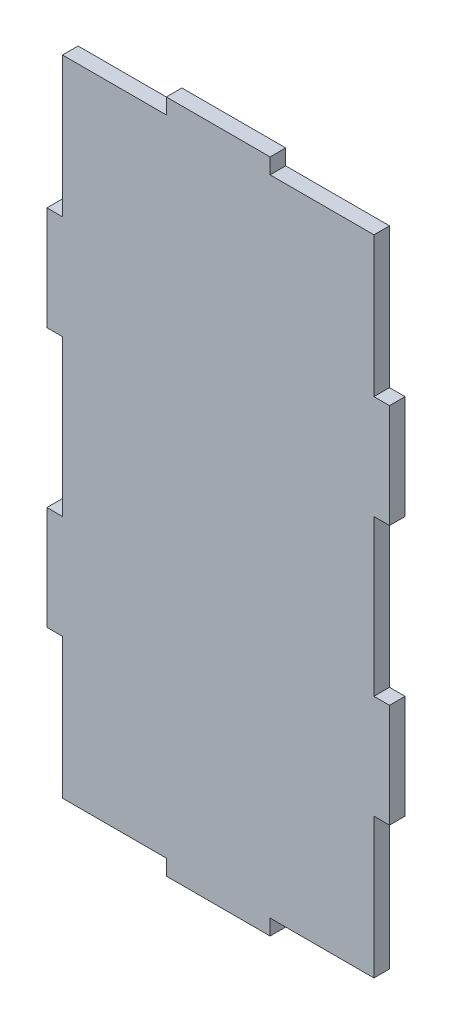
ISO-10303-21;
HEADER;
FILE_DESCRIPTION(('STEP AP214'),'2;1');
FILE_NAME('part.step','',(''),(''),'','','');
FILE_SCHEMA(('AUTOMOTIVE_DESIGN { 1 0 10303 214 1 1 1 1 }'));
ENDSEC;
DATA;
#1=APPLICATION_CONTEXT('core data for automotive mechanical design processes');
#2=APPLICATION_PROTOCOL_DEFINITION('international standard','automotive_design',2000,#1);
#3=PRODUCT_CONTEXT('',#1,'mechanical');
#4=PRODUCT('Part','Part','',(#3));
#5=PRODUCT_RELATED_PRODUCT_CATEGORY('part','',(#4));
#6=PRODUCT_DEFINITION_FORMATION('','',#4);
#7=PRODUCT_DEFINITION_CONTEXT('part definition',#1,'design');
#8=PRODUCT_DEFINITION('design','',#6,#7);
#9=PRODUCT_DEFINITION_SHAPE('','',#8);
#10=(LENGTH_UNIT() NAMED_UNIT(*) SI_UNIT(.MILLI.,.METRE.));
#11=(NAMED_UNIT(*) PLANE_ANGLE_UNIT() SI_UNIT($,.RADIAN.));
#12=(NAMED_UNIT(*) SI_UNIT($,.STERADIAN.) SOLID_ANGLE_UNIT());
#13=UNCERTAINTY_MEASURE_WITH_UNIT(LENGTH_MEASURE(1.E-05),#10,'distance_accuracy_value','');
#14=(GEOMETRIC_REPRESENTATION_CONTEXT(3) GLOBAL_UNCERTAINTY_ASSIGNED_CONTEXT((#13)) GLOBAL_UNIT_ASSIGNED_CONTEXT((#10,
#11,#12)) REPRESENTATION_CONTEXT('',''));
#15=CARTESIAN_POINT('',(0.,0.,0.));
#16=DIRECTION('',(0.,0.,1.));
#17=DIRECTION('',(1.,0.,0.));
#18=AXIS2_PLACEMENT_3D('',#15,#16,#17);
#19=CARTESIAN_POINT('',(0.,61.9999999999997,3.));
#20=DIRECTION('',(0.,-1.,0.));
#21=DIRECTION('',(1.,0.,0.));
#22=AXIS2_PLACEMENT_3D('',#19,#20,#21);
#23=PLANE('',#22);
#24=DIRECTION('',(-1.,0.,0.));
#25=VECTOR('',#24,1.);
#26=CARTESIAN_POINT('',(0.,61.9999999999997,0.));
#27=LINE('',#26,#25);
#28=CARTESIAN_POINT('',(30.,61.9999999999997,0.));
#29=VERTEX_POINT('',#28);
#30=CARTESIAN_POINT('',(9.99999999999999,61.9999999999997,0.));
#31=VERTEX_POINT('',#30);
#32=EDGE_CURVE('E253',#29,#31,#27,.T.);
#33=ORIENTED_EDGE('',*,*,#32,.T.);
#34=DIRECTION('',(0.,0.,-1.));
#35=VECTOR('',#34,1.);
#36=CARTESIAN_POINT('',(9.99999999999999,61.9999999999997,3.));
#37=LINE('',#36,#35);
#38=CARTESIAN_POINT('',(9.99999999999999,61.9999999999997,3.));
#39=VERTEX_POINT('',#38);
#40=EDGE_CURVE('E11',#39,#31,#37,.T.);
#41=ORIENTED_EDGE('',*,*,#40,.F.);
#42=DIRECTION('',(-1.,0.,0.));
#43=VECTOR('',#42,1.);
#44=CARTESIAN_POINT('',(0.,61.9999999999997,3.));
#45=LINE('',#44,#43);
#46=CARTESIAN_POINT('',(30.,61.9999999999997,3.));
#47=VERTEX_POINT('',#46);
#48=EDGE_CURVE('E388',#47,#39,#45,.T.);
#49=ORIENTED_EDGE('',*,*,#48,.F.);
#50=DIRECTION('',(0.,0.,-1.));
#51=VECTOR('',#50,1.);
#52=CARTESIAN_POINT('',(30.,61.9999999999997,3.));
#53=LINE('',#52,#51);
#54=EDGE_CURVE('E247',#47,#29,#53,.T.);
#55=ORIENTED_EDGE('',*,*,#54,.T.);
#56=EDGE_LOOP('',(#33,#41,#49,#55));
#57=FACE_BOUND('',#56,.T.);
#58=ADVANCED_FACE('F35',(#57),#23,.F.);
#59=CARTESIAN_POINT('',(9.99999999999997,0.,3.));
#60=DIRECTION('',(-1.,0.,0.));
#61=DIRECTION('',(0.,-1.,0.));
#62=AXIS2_PLACEMENT_3D('',#59,#60,#61);
#63=PLANE('',#62);
#64=DIRECTION('',(0.,1.,0.));
#65=VECTOR('',#64,1.);
#66=CARTESIAN_POINT('',(9.99999999999997,0.,0.));
#67=LINE('',#66,#65);
#68=CARTESIAN_POINT('',(9.99999999999999,64.9999999999998,0.));
#69=VERTEX_POINT('',#68);
#70=EDGE_CURVE('E256',#31,#69,#67,.T.);
#71=ORIENTED_EDGE('',*,*,#70,.T.);
#72=DIRECTION('',(0.,0.,-1.));
#73=VECTOR('',#72,1.);
#74=CARTESIAN_POINT('',(9.99999999999999,64.9999999999998,3.));
#75=LINE('',#74,#73);
#76=CARTESIAN_POINT('',(9.99999999999999,64.9999999999998,3.));
#77=VERTEX_POINT('',#76);
#78=EDGE_CURVE('E44',#77,#69,#75,.T.);
#79=ORIENTED_EDGE('',*,*,#78,.F.);
#80=DIRECTION('',(0.,1.,0.));
#81=VECTOR('',#80,1.);
#82=CARTESIAN_POINT('',(9.99999999999997,0.,3.));
#83=LINE('',#82,#81);
#84=EDGE_CURVE('E155',#39,#77,#83,.T.);
#85=ORIENTED_EDGE('',*,*,#84,.F.);
#86=ORIENTED_EDGE('',*,*,#40,.T.);
#87=EDGE_LOOP('',(#71,#79,#85,#86));
#88=FACE_BOUND('',#87,.T.);
#89=ADVANCED_FACE('F37',(#88),#63,.F.);
#90=CARTESIAN_POINT('',(0.,64.9999999999998,3.));
#91=DIRECTION('',(0.,-1.,0.));
#92=DIRECTION('',(1.,0.,0.));
#93=AXIS2_PLACEMENT_3D('',#90,#91,#92);
#94=PLANE('',#93);
#95=DIRECTION('',(-1.,0.,0.));
#96=VECTOR('',#95,1.);
#97=CARTESIAN_POINT('',(0.,64.9999999999998,0.));
#98=LINE('',#97,#96);
#99=CARTESIAN_POINT('',(-10.,64.9999999999998,0.));
#100=VERTEX_POINT('',#99);
#101=EDGE_CURVE('E259',#69,#100,#98,.T.);
#102=ORIENTED_EDGE('',*,*,#101,.T.);
#103=DIRECTION('',(0.,0.,-1.));
#104=VECTOR('',#103,1.);
#105=CARTESIAN_POINT('',(-10.,64.9999999999998,3.));
#106=LINE('',#105,#104);
#107=CARTESIAN_POINT('',(-10.,64.9999999999998,3.));
#108=VERTEX_POINT('',#107);
#109=EDGE_CURVE('E364',#108,#100,#106,.T.);
#110=ORIENTED_EDGE('',*,*,#109,.F.);
#111=DIRECTION('',(-1.,0.,0.));
#112=VECTOR('',#111,1.);
#113=CARTESIAN_POINT('',(0.,64.9999999999998,3.));
#114=LINE('',#113,#112);
#115=EDGE_CURVE('E371',#77,#108,#114,.T.);
#116=ORIENTED_EDGE('',*,*,#115,.F.);
#117=ORIENTED_EDGE('',*,*,#78,.T.);
#118=EDGE_LOOP('',(#102,#110,#116,#117));
#119=FACE_BOUND('',#118,.T.);
#120=ADVANCED_FACE('F369',(#119),#94,.F.);
#121=CARTESIAN_POINT('',(-10.,0.,3.));
#122=DIRECTION('',(-1.,0.,0.));
#123=DIRECTION('',(0.,-1.,0.));
#124=AXIS2_PLACEMENT_3D('',#121,#122,#123);
#125=PLANE('',#124);
#126=DIRECTION('',(0.,1.,0.));
#127=VECTOR('',#126,1.);
#128=CARTESIAN_POINT('',(-10.,0.,0.));
#129=LINE('',#128,#127);
#130=CARTESIAN_POINT('',(-10.,61.9999999999997,0.));
#131=VERTEX_POINT('',#130);
#132=EDGE_CURVE('E262',#131,#100,#129,.T.);
#133=ORIENTED_EDGE('',*,*,#132,.F.);
#134=DIRECTION('',(0.,0.,-1.));
#135=VECTOR('',#134,1.);
#136=CARTESIAN_POINT('',(-10.,61.9999999999997,3.));
#137=LINE('',#136,#135);
#138=CARTESIAN_POINT('',(-10.,61.9999999999997,3.));
#139=VERTEX_POINT('',#138);
#140=EDGE_CURVE('E362',#139,#131,#137,.T.);
#141=ORIENTED_EDGE('',*,*,#140,.F.);
#142=DIRECTION('',(0.,1.,0.));
#143=VECTOR('',#142,1.);
#144=CARTESIAN_POINT('',(-10.,0.,3.));
#145=LINE('',#144,#143);
#146=EDGE_CURVE('E383',#139,#108,#145,.T.);
#147=ORIENTED_EDGE('',*,*,#146,.T.);
#148=ORIENTED_EDGE('',*,*,#109,.T.);
#149=EDGE_LOOP('',(#133,#141,#147,#148));
#150=FACE_BOUND('',#149,.T.);
#151=ADVANCED_FACE('F379',(#150),#125,.T.);
#152=CARTESIAN_POINT('',(-30.,61.9999999999997,0.));
#153=VERTEX_POINT('',#152);
#154=EDGE_CURVE('E257',#131,#153,#27,.T.);
#155=ORIENTED_EDGE('',*,*,#154,.T.);
#156=DIRECTION('',(0.,0.,-1.));
#157=VECTOR('',#156,1.);
#158=CARTESIAN_POINT('',(-30.,61.9999999999997,3.));
#159=LINE('',#158,#157);
#160=CARTESIAN_POINT('',(-30.,61.9999999999997,3.));
#161=VERTEX_POINT('',#160);
#162=EDGE_CURVE('E360',#161,#153,#159,.T.);
#163=ORIENTED_EDGE('',*,*,#162,.F.);
#164=EDGE_CURVE('E384',#139,#161,#45,.T.);
#165=ORIENTED_EDGE('',*,*,#164,.F.);
#166=ORIENTED_EDGE('',*,*,#140,.T.);
#167=EDGE_LOOP('',(#155,#163,#165,#166));
#168=FACE_BOUND('',#167,.T.);
#169=ADVANCED_FACE('F451',(#168),#23,.F.);
#170=CARTESIAN_POINT('',(-30.,0.,3.));
#171=DIRECTION('',(-1.,0.,0.));
#172=DIRECTION('',(0.,-1.,0.));
#173=AXIS2_PLACEMENT_3D('',#170,#171,#172);
#174=PLANE('',#173);
#175=DIRECTION('',(0.,1.,0.));
#176=VECTOR('',#175,1.);
#177=CARTESIAN_POINT('',(-30.,0.,0.));
#178=LINE('',#177,#176);
#179=CARTESIAN_POINT('',(-30.,35.,0.));
#180=VERTEX_POINT('',#179);
#181=EDGE_CURVE('E265',#180,#153,#178,.T.);
#182=ORIENTED_EDGE('',*,*,#181,.F.);
#183=DIRECTION('',(0.,0.,-1.));
#184=VECTOR('',#183,1.);
#185=CARTESIAN_POINT('',(-30.,35.,3.));
#186=LINE('',#185,#184);
#187=CARTESIAN_POINT('',(-30.,35.,3.));
#188=VERTEX_POINT('',#187);
#189=EDGE_CURVE('E358',#188,#180,#186,.T.);
#190=ORIENTED_EDGE('',*,*,#189,.F.);
#191=DIRECTION('',(0.,1.,0.));
#192=VECTOR('',#191,1.);
#193=CARTESIAN_POINT('',(-30.,0.,3.));
#194=LINE('',#193,#192);
#195=EDGE_CURVE('E386',#188,#161,#194,.T.);
#196=ORIENTED_EDGE('',*,*,#195,.T.);
#197=ORIENTED_EDGE('',*,*,#162,.T.);
#198=EDGE_LOOP('',(#182,#190,#196,#197));
#199=FACE_BOUND('',#198,.T.);
#200=ADVANCED_FACE('F457',(#199),#174,.T.);
#201=CARTESIAN_POINT('',(0.,35.,3.));
#202=DIRECTION('',(0.,-1.,0.));
#203=DIRECTION('',(0.,0.,-1.));
#204=AXIS2_PLACEMENT_3D('',#201,#202,#203);
#205=PLANE('',#204);
#206=DIRECTION('',(-1.,0.,0.));
#207=VECTOR('',#206,1.);
#208=CARTESIAN_POINT('',(0.,35.,0.));
#209=LINE('',#208,#207);
#210=CARTESIAN_POINT('',(-33.,35.,0.));
#211=VERTEX_POINT('',#210);
#212=EDGE_CURVE('E268',#180,#211,#209,.T.);
#213=ORIENTED_EDGE('',*,*,#212,.T.);
#214=DIRECTION('',(0.,0.,-1.));
#215=VECTOR('',#214,1.);
#216=CARTESIAN_POINT('',(-33.,35.,3.));
#217=LINE('',#216,#215);
#218=CARTESIAN_POINT('',(-33.,35.,3.));
#219=VERTEX_POINT('',#218);
#220=EDGE_CURVE('E356',#219,#211,#217,.T.);
#221=ORIENTED_EDGE('',*,*,#220,.F.);
#222=DIRECTION('',(-1.,0.,0.));
#223=VECTOR('',#222,1.);
#224=CARTESIAN_POINT('',(0.,35.,3.));
#225=LINE('',#224,#223);
#226=EDGE_CURVE('E394',#188,#219,#225,.T.);
#227=ORIENTED_EDGE('',*,*,#226,.F.);
#228=ORIENTED_EDGE('',*,*,#189,.T.);
#229=EDGE_LOOP('',(#213,#221,#227,#228));
#230=FACE_BOUND('',#229,.T.);
#231=ADVANCED_FACE('F463',(#230),#205,.F.);
#232=CARTESIAN_POINT('',(-33.,0.,3.));
#233=DIRECTION('',(-1.,0.,0.));
#234=DIRECTION('',(0.,0.,1.));
#235=AXIS2_PLACEMENT_3D('',#232,#233,#234);
#236=PLANE('',#235);
#237=DIRECTION('',(0.,1.,0.));
#238=VECTOR('',#237,1.);
#239=CARTESIAN_POINT('',(-33.,0.,0.));
#240=LINE('',#239,#238);
#241=CARTESIAN_POINT('',(-33.,15.,0.));
#242=VERTEX_POINT('',#241);
#243=EDGE_CURVE('E273',#242,#211,#240,.T.);
#244=ORIENTED_EDGE('',*,*,#243,.F.);
#245=DIRECTION('',(0.,0.,-1.));
#246=VECTOR('',#245,1.);
#247=CARTESIAN_POINT('',(-33.,15.,3.));
#248=LINE('',#247,#246);
#249=CARTESIAN_POINT('',(-33.,15.,3.));
#250=VERTEX_POINT('',#249);
#251=EDGE_CURVE('E354',#250,#242,#248,.T.);
#252=ORIENTED_EDGE('',*,*,#251,.F.);
#253=DIRECTION('',(0.,1.,0.));
#254=VECTOR('',#253,1.);
#255=CARTESIAN_POINT('',(-33.,0.,3.));
#256=LINE('',#255,#254);
#257=EDGE_CURVE('E398',#250,#219,#256,.T.);
#258=ORIENTED_EDGE('',*,*,#257,.T.);
#259=ORIENTED_EDGE('',*,*,#220,.T.);
#260=EDGE_LOOP('',(#244,#252,#258,#259));
#261=FACE_BOUND('',#260,.T.);
#262=ADVANCED_FACE('F479',(#261),#236,.T.);
#263=CARTESIAN_POINT('',(0.,15.,3.));
#264=DIRECTION('',(0.,-1.,0.));
#265=DIRECTION('',(0.,0.,-1.));
#266=AXIS2_PLACEMENT_3D('',#263,#264,#265);
#267=PLANE('',#266);
#268=DIRECTION('',(-1.,0.,0.));
#269=VECTOR('',#268,1.);
#270=CARTESIAN_POINT('',(0.,15.,0.));
#271=LINE('',#270,#269);
#272=CARTESIAN_POINT('',(-30.,15.,0.));
#273=VERTEX_POINT('',#272);
#274=EDGE_CURVE('E276',#273,#242,#271,.T.);
#275=ORIENTED_EDGE('',*,*,#274,.F.);
#276=DIRECTION('',(0.,0.,-1.));
#277=VECTOR('',#276,1.);
#278=CARTESIAN_POINT('',(-30.,15.,3.));
#279=LINE('',#278,#277);
#280=CARTESIAN_POINT('',(-30.,15.,3.));
#281=VERTEX_POINT('',#280);
#282=EDGE_CURVE('E352',#281,#273,#279,.T.);
#283=ORIENTED_EDGE('',*,*,#282,.F.);
#284=DIRECTION('',(-1.,0.,0.));
#285=VECTOR('',#284,1.);
#286=CARTESIAN_POINT('',(0.,15.,3.));
#287=LINE('',#286,#285);
#288=EDGE_CURVE('E401',#281,#250,#287,.T.);
#289=ORIENTED_EDGE('',*,*,#288,.T.);
#290=ORIENTED_EDGE('',*,*,#251,.T.);
#291=EDGE_LOOP('',(#275,#283,#289,#290));
#292=FACE_BOUND('',#291,.T.);
#293=ADVANCED_FACE('F482',(#292),#267,.T.);
#294=CARTESIAN_POINT('',(-30.,-15.,0.));
#295=VERTEX_POINT('',#294);
#296=EDGE_CURVE('E270',#295,#273,#178,.T.);
#297=ORIENTED_EDGE('',*,*,#296,.F.);
#298=DIRECTION('',(0.,0.,-1.));
#299=VECTOR('',#298,1.);
#300=CARTESIAN_POINT('',(-30.,-15.,3.));
#301=LINE('',#300,#299);
#302=CARTESIAN_POINT('',(-30.,-15.,3.));
#303=VERTEX_POINT('',#302);
#304=EDGE_CURVE('E350',#303,#295,#301,.T.);
#305=ORIENTED_EDGE('',*,*,#304,.F.);
#306=EDGE_CURVE('E396',#303,#281,#194,.T.);
#307=ORIENTED_EDGE('',*,*,#306,.T.);
#308=ORIENTED_EDGE('',*,*,#282,.T.);
#309=EDGE_LOOP('',(#297,#305,#307,#308));
#310=FACE_BOUND('',#309,.T.);
#311=ADVANCED_FACE('F466',(#310),#174,.T.);
#312=CARTESIAN_POINT('',(0.,-15.,3.));
#313=DIRECTION('',(0.,-1.,0.));
#314=DIRECTION('',(1.,0.,0.));
#315=AXIS2_PLACEMENT_3D('',#312,#313,#314);
#316=PLANE('',#315);
#317=DIRECTION('',(-1.,0.,0.));
#318=VECTOR('',#317,1.);
#319=CARTESIAN_POINT('',(0.,-15.,0.));
#320=LINE('',#319,#318);
#321=CARTESIAN_POINT('',(-33.,-15.,0.));
#322=VERTEX_POINT('',#321);
#323=EDGE_CURVE('E279',#295,#322,#320,.T.);
#324=ORIENTED_EDGE('',*,*,#323,.T.);
#325=DIRECTION('',(0.,0.,-1.));
#326=VECTOR('',#325,1.);
#327=CARTESIAN_POINT('',(-33.,-15.,3.));
#328=LINE('',#327,#326);
#329=CARTESIAN_POINT('',(-33.,-15.,3.));
#330=VERTEX_POINT('',#329);
#331=EDGE_CURVE('E348',#330,#322,#328,.T.);
#332=ORIENTED_EDGE('',*,*,#331,.F.);
#333=DIRECTION('',(-1.,0.,0.));
#334=VECTOR('',#333,1.);
#335=CARTESIAN_POINT('',(0.,-15.,3.));
#336=LINE('',#335,#334);
#337=EDGE_CURVE('E404',#303,#330,#336,.T.);
#338=ORIENTED_EDGE('',*,*,#337,.F.);
#339=ORIENTED_EDGE('',*,*,#304,.T.);
#340=EDGE_LOOP('',(#324,#332,#338,#339));
#341=FACE_BOUND('',#340,.T.);
#342=ADVANCED_FACE('F540',(#341),#316,.F.);
#343=CARTESIAN_POINT('',(-33.,0.,3.));
#344=DIRECTION('',(-1.,0.,0.));
#345=DIRECTION('',(0.,0.,1.));
#346=AXIS2_PLACEMENT_3D('',#343,#344,#345);
#347=PLANE('',#346);
#348=DIRECTION('',(0.,1.,0.));
#349=VECTOR('',#348,1.);
#350=CARTESIAN_POINT('',(-33.,0.,0.));
#351=LINE('',#350,#349);
#352=CARTESIAN_POINT('',(-33.,-35.,0.));
#353=VERTEX_POINT('',#352);
#354=EDGE_CURVE('E282',#353,#322,#351,.T.);
#355=ORIENTED_EDGE('',*,*,#354,.F.);
#356=DIRECTION('',(0.,0.,-1.));
#357=VECTOR('',#356,1.);
#358=CARTESIAN_POINT('',(-33.,-35.,3.));
#359=LINE('',#358,#357);
#360=CARTESIAN_POINT('',(-33.,-35.,3.));
#361=VERTEX_POINT('',#360);
#362=EDGE_CURVE('E346',#361,#353,#359,.T.);
#363=ORIENTED_EDGE('',*,*,#362,.F.);
#364=DIRECTION('',(0.,1.,0.));
#365=VECTOR('',#364,1.);
#366=CARTESIAN_POINT('',(-33.,0.,3.));
#367=LINE('',#366,#365);
#368=EDGE_CURVE('E406',#361,#330,#367,.T.);
#369=ORIENTED_EDGE('',*,*,#368,.T.);
#370=ORIENTED_EDGE('',*,*,#331,.T.);
#371=EDGE_LOOP('',(#355,#363,#369,#370));
#372=FACE_BOUND('',#371,.T.);
#373=ADVANCED_FACE('F544',(#372),#347,.T.);
#374=CARTESIAN_POINT('',(0.,-35.,3.));
#375=DIRECTION('',(0.,-1.,0.));
#376=DIRECTION('',(0.,0.,-1.));
#377=AXIS2_PLACEMENT_3D('',#374,#375,#376);
#378=PLANE('',#377);
#379=DIRECTION('',(-1.,0.,0.));
#380=VECTOR('',#379,1.);
#381=CARTESIAN_POINT('',(0.,-35.,0.));
#382=LINE('',#381,#380);
#383=CARTESIAN_POINT('',(-30.,-35.,0.));
#384=VERTEX_POINT('',#383);
#385=EDGE_CURVE('E285',#384,#353,#382,.T.);
#386=ORIENTED_EDGE('',*,*,#385,.F.);
#387=DIRECTION('',(0.,0.,-1.));
#388=VECTOR('',#387,1.);
#389=CARTESIAN_POINT('',(-30.,-35.,3.));
#390=LINE('',#389,#388);
#391=CARTESIAN_POINT('',(-30.,-35.,3.));
#392=VERTEX_POINT('',#391);
#393=EDGE_CURVE('E344',#392,#384,#390,.T.);
#394=ORIENTED_EDGE('',*,*,#393,.F.);
#395=DIRECTION('',(-1.,0.,0.));
#396=VECTOR('',#395,1.);
#397=CARTESIAN_POINT('',(0.,-35.,3.));
#398=LINE('',#397,#396);
#399=EDGE_CURVE('E409',#392,#361,#398,.T.);
#400=ORIENTED_EDGE('',*,*,#399,.T.);
#401=ORIENTED_EDGE('',*,*,#362,.T.);
#402=EDGE_LOOP('',(#386,#394,#400,#401));
#403=FACE_BOUND('',#402,.T.);
#404=ADVANCED_FACE('F543',(#403),#378,.T.);
#405=CARTESIAN_POINT('',(-30.,-62.0000000000003,0.));
#406=VERTEX_POINT('',#405);
#407=EDGE_CURVE('E269',#406,#384,#178,.T.);
#408=ORIENTED_EDGE('',*,*,#407,.F.);
#409=DIRECTION('',(0.,0.,-1.));
#410=VECTOR('',#409,1.);
#411=CARTESIAN_POINT('',(-30.,-62.0000000000003,3.));
#412=LINE('',#411,#410);
#413=CARTESIAN_POINT('',(-30.,-62.0000000000003,3.));
#414=VERTEX_POINT('',#413);
#415=EDGE_CURVE('E342',#414,#406,#412,.T.);
#416=ORIENTED_EDGE('',*,*,#415,.F.);
#417=EDGE_CURVE('E395',#414,#392,#194,.T.);
#418=ORIENTED_EDGE('',*,*,#417,.T.);
#419=ORIENTED_EDGE('',*,*,#393,.T.);
#420=EDGE_LOOP('',(#408,#416,#418,#419));
#421=FACE_BOUND('',#420,.T.);
#422=ADVANCED_FACE('F467',(#421),#174,.T.);
#423=CARTESIAN_POINT('',(0.,-62.0000000000003,3.));
#424=DIRECTION('',(0.,-1.,0.));
#425=DIRECTION('',(1.,0.,0.));
#426=AXIS2_PLACEMENT_3D('',#423,#424,#425);
#427=PLANE('',#426);
#428=DIRECTION('',(-1.,0.,0.));
#429=VECTOR('',#428,1.);
#430=CARTESIAN_POINT('',(0.,-62.0000000000003,0.));
#431=LINE('',#430,#429);
#432=CARTESIAN_POINT('',(-10.,-62.0000000000003,0.));
#433=VERTEX_POINT('',#432);
#434=EDGE_CURVE('E288',#433,#406,#431,.T.);
#435=ORIENTED_EDGE('',*,*,#434,.F.);
#436=DIRECTION('',(0.,0.,-1.));
#437=VECTOR('',#436,1.);
#438=CARTESIAN_POINT('',(-10.,-62.0000000000003,3.));
#439=LINE('',#438,#437);
#440=CARTESIAN_POINT('',(-10.,-62.0000000000003,3.));
#441=VERTEX_POINT('',#440);
#442=EDGE_CURVE('E340',#441,#433,#439,.T.);
#443=ORIENTED_EDGE('',*,*,#442,.F.);
#444=DIRECTION('',(-1.,0.,0.));
#445=VECTOR('',#444,1.);
#446=CARTESIAN_POINT('',(0.,-62.0000000000003,3.));
#447=LINE('',#446,#445);
#448=EDGE_CURVE('E412',#441,#414,#447,.T.);
#449=ORIENTED_EDGE('',*,*,#448,.T.);
#450=ORIENTED_EDGE('',*,*,#415,.T.);
#451=EDGE_LOOP('',(#435,#443,#449,#450));
#452=FACE_BOUND('',#451,.T.);
#453=ADVANCED_FACE('F500',(#452),#427,.T.);
#454=CARTESIAN_POINT('',(-10.,0.,3.));
#455=DIRECTION('',(-1.,0.,0.));
#456=DIRECTION('',(0.,0.,1.));
#457=AXIS2_PLACEMENT_3D('',#454,#455,#456);
#458=PLANE('',#457);
#459=DIRECTION('',(0.,1.,0.));
#460=VECTOR('',#459,1.);
#461=CARTESIAN_POINT('',(-10.,0.,0.));
#462=LINE('',#461,#460);
#463=CARTESIAN_POINT('',(-10.,-65.0000000000002,0.));
#464=VERTEX_POINT('',#463);
#465=EDGE_CURVE('E291',#464,#433,#462,.T.);
#466=ORIENTED_EDGE('',*,*,#465,.F.);
#467=DIRECTION('',(0.,0.,-1.));
#468=VECTOR('',#467,1.);
#469=CARTESIAN_POINT('',(-10.,-65.0000000000002,3.));
#470=LINE('',#469,#468);
#471=CARTESIAN_POINT('',(-10.,-65.0000000000002,3.));
#472=VERTEX_POINT('',#471);
#473=EDGE_CURVE('E338',#472,#464,#470,.T.);
#474=ORIENTED_EDGE('',*,*,#473,.F.);
#475=DIRECTION('',(0.,1.,0.));
#476=VECTOR('',#475,1.);
#477=CARTESIAN_POINT('',(-10.,0.,3.));
#478=LINE('',#477,#476);
#479=EDGE_CURVE('E415',#472,#441,#478,.T.);
#480=ORIENTED_EDGE('',*,*,#479,.T.);
#481=ORIENTED_EDGE('',*,*,#442,.T.);
#482=EDGE_LOOP('',(#466,#474,#480,#481));
#483=FACE_BOUND('',#482,.T.);
#484=ADVANCED_FACE('F503',(#483),#458,.T.);
#485=CARTESIAN_POINT('',(0.,-65.0000000000002,3.));
#486=DIRECTION('',(0.,-1.,0.));
#487=DIRECTION('',(0.,0.,-1.));
#488=AXIS2_PLACEMENT_3D('',#485,#486,#487);
#489=PLANE('',#488);
#490=DIRECTION('',(-1.,0.,0.));
#491=VECTOR('',#490,1.);
#492=CARTESIAN_POINT('',(0.,-65.0000000000002,0.));
#493=LINE('',#492,#491);
#494=CARTESIAN_POINT('',(10.,-65.0000000000002,0.));
#495=VERTEX_POINT('',#494);
#496=EDGE_CURVE('E295',#495,#464,#493,.T.);
#497=ORIENTED_EDGE('',*,*,#496,.F.);
#498=DIRECTION('',(0.,0.,-1.));
#499=VECTOR('',#498,1.);
#500=CARTESIAN_POINT('',(10.,-65.0000000000002,3.));
#501=LINE('',#500,#499);
#502=CARTESIAN_POINT('',(10.,-65.0000000000002,3.));
#503=VERTEX_POINT('',#502);
#504=EDGE_CURVE('E336',#503,#495,#501,.T.);
#505=ORIENTED_EDGE('',*,*,#504,.F.);
#506=DIRECTION('',(-1.,0.,0.));
#507=VECTOR('',#506,1.);
#508=CARTESIAN_POINT('',(0.,-65.0000000000002,3.));
#509=LINE('',#508,#507);
#510=EDGE_CURVE('E419',#503,#472,#509,.T.);
#511=ORIENTED_EDGE('',*,*,#510,.T.);
#512=ORIENTED_EDGE('',*,*,#473,.T.);
#513=EDGE_LOOP('',(#497,#505,#511,#512));
#514=FACE_BOUND('',#513,.T.);
#515=ADVANCED_FACE('F507',(#514),#489,.T.);
#516=CARTESIAN_POINT('',(10.,0.,3.));
#517=DIRECTION('',(-1.,0.,0.));
#518=DIRECTION('',(0.,0.,1.));
#519=AXIS2_PLACEMENT_3D('',#516,#517,#518);
#520=PLANE('',#519);
#521=DIRECTION('',(0.,1.,0.));
#522=VECTOR('',#521,1.);
#523=CARTESIAN_POINT('',(10.,0.,0.));
#524=LINE('',#523,#522);
#525=CARTESIAN_POINT('',(10.,-62.0000000000003,0.));
#526=VERTEX_POINT('',#525);
#527=EDGE_CURVE('E298',#495,#526,#524,.T.);
#528=ORIENTED_EDGE('',*,*,#527,.T.);
#529=DIRECTION('',(0.,0.,-1.));
#530=VECTOR('',#529,1.);
#531=CARTESIAN_POINT('',(10.,-62.0000000000003,3.));
#532=LINE('',#531,#530);
#533=CARTESIAN_POINT('',(10.,-62.0000000000003,3.));
#534=VERTEX_POINT('',#533);
#535=EDGE_CURVE('E334',#534,#526,#532,.T.);
#536=ORIENTED_EDGE('',*,*,#535,.F.);
#537=DIRECTION('',(0.,1.,0.));
#538=VECTOR('',#537,1.);
#539=CARTESIAN_POINT('',(10.,0.,3.));
#540=LINE('',#539,#538);
#541=EDGE_CURVE('E422',#503,#534,#540,.T.);
#542=ORIENTED_EDGE('',*,*,#541,.F.);
#543=ORIENTED_EDGE('',*,*,#504,.T.);
#544=EDGE_LOOP('',(#528,#536,#542,#543));
#545=FACE_BOUND('',#544,.T.);
#546=ADVANCED_FACE('F512',(#545),#520,.F.);
#547=CARTESIAN_POINT('',(30.,-62.0000000000003,0.));
#548=VERTEX_POINT('',#547);
#549=EDGE_CURVE('E292',#548,#526,#431,.T.);
#550=ORIENTED_EDGE('',*,*,#549,.F.);
#551=DIRECTION('',(0.,0.,-1.));
#552=VECTOR('',#551,1.);
#553=CARTESIAN_POINT('',(30.,-62.0000000000003,3.));
#554=LINE('',#553,#552);
#555=CARTESIAN_POINT('',(30.,-62.0000000000003,3.));
#556=VERTEX_POINT('',#555);
#557=EDGE_CURVE('E332',#556,#548,#554,.T.);
#558=ORIENTED_EDGE('',*,*,#557,.F.);
#559=EDGE_CURVE('E416',#556,#534,#447,.T.);
#560=ORIENTED_EDGE('',*,*,#559,.T.);
#561=ORIENTED_EDGE('',*,*,#535,.T.);
#562=EDGE_LOOP('',(#550,#558,#560,#561));
#563=FACE_BOUND('',#562,.T.);
#564=ADVANCED_FACE('F520',(#563),#427,.T.);
#565=CARTESIAN_POINT('',(30.,0.,3.));
#566=DIRECTION('',(-1.,0.,0.));
#567=DIRECTION('',(0.,-1.,0.));
#568=AXIS2_PLACEMENT_3D('',#565,#566,#567);
#569=PLANE('',#568);
#570=DIRECTION('',(0.,1.,0.));
#571=VECTOR('',#570,1.);
#572=CARTESIAN_POINT('',(30.,0.,0.));
#573=LINE('',#572,#571);
#574=CARTESIAN_POINT('',(30.,-35.0000000000001,0.));
#575=VERTEX_POINT('',#574);
#576=EDGE_CURVE('E301',#548,#575,#573,.T.);
#577=ORIENTED_EDGE('',*,*,#576,.T.);
#578=DIRECTION('',(0.,0.,-1.));
#579=VECTOR('',#578,1.);
#580=CARTESIAN_POINT('',(30.,-35.0000000000001,3.));
#581=LINE('',#580,#579);
#582=CARTESIAN_POINT('',(30.,-35.0000000000001,3.));
#583=VERTEX_POINT('',#582);
#584=EDGE_CURVE('E330',#583,#575,#581,.T.);
#585=ORIENTED_EDGE('',*,*,#584,.F.);
#586=DIRECTION('',(0.,1.,0.));
#587=VECTOR('',#586,1.);
#588=CARTESIAN_POINT('',(30.,0.,3.));
#589=LINE('',#588,#587);
#590=EDGE_CURVE('E250',#556,#583,#589,.T.);
#591=ORIENTED_EDGE('',*,*,#590,.F.);
#592=ORIENTED_EDGE('',*,*,#557,.T.);
#593=EDGE_LOOP('',(#577,#585,#591,#592));
#594=FACE_BOUND('',#593,.T.);
#595=ADVANCED_FACE('F524',(#594),#569,.F.);
#596=CARTESIAN_POINT('',(0.,-35.0000000000001,3.));
#597=DIRECTION('',(0.,-1.,0.));
#598=DIRECTION('',(0.,0.,-1.));
#599=AXIS2_PLACEMENT_3D('',#596,#597,#598);
#600=PLANE('',#599);
#601=DIRECTION('',(-1.,0.,0.));
#602=VECTOR('',#601,1.);
#603=CARTESIAN_POINT('',(0.,-35.0000000000001,0.));
#604=LINE('',#603,#602);
#605=CARTESIAN_POINT('',(33.,-35.0000000000001,0.));
#606=VERTEX_POINT('',#605);
#607=EDGE_CURVE('E304',#606,#575,#604,.T.);
#608=ORIENTED_EDGE('',*,*,#607,.F.);
#609=DIRECTION('',(0.,0.,-1.));
#610=VECTOR('',#609,1.);
#611=CARTESIAN_POINT('',(33.,-35.0000000000001,3.));
#612=LINE('',#611,#610);
#613=CARTESIAN_POINT('',(33.,-35.0000000000001,3.));
#614=VERTEX_POINT('',#613);
#615=EDGE_CURVE('E328',#614,#606,#612,.T.);
#616=ORIENTED_EDGE('',*,*,#615,.F.);
#617=DIRECTION('',(-1.,0.,0.));
#618=VECTOR('',#617,1.);
#619=CARTESIAN_POINT('',(0.,-35.0000000000001,3.));
#620=LINE('',#619,#618);
#621=EDGE_CURVE('E424',#614,#583,#620,.T.);
#622=ORIENTED_EDGE('',*,*,#621,.T.);
#623=ORIENTED_EDGE('',*,*,#584,.T.);
#624=EDGE_LOOP('',(#608,#616,#622,#623));
#625=FACE_BOUND('',#624,.T.);
#626=ADVANCED_FACE('F527',(#625),#600,.T.);
#627=CARTESIAN_POINT('',(33.,0.,3.));
#628=DIRECTION('',(-1.,0.,0.));
#629=DIRECTION('',(0.,0.,1.));
#630=AXIS2_PLACEMENT_3D('',#627,#628,#629);
#631=PLANE('',#630);
#632=DIRECTION('',(0.,1.,0.));
#633=VECTOR('',#632,1.);
#634=CARTESIAN_POINT('',(33.,0.,0.));
#635=LINE('',#634,#633);
#636=CARTESIAN_POINT('',(33.,-15.0000000000001,0.));
#637=VERTEX_POINT('',#636);
#638=EDGE_CURVE('E308',#606,#637,#635,.T.);
#639=ORIENTED_EDGE('',*,*,#638,.T.);
#640=DIRECTION('',(0.,0.,-1.));
#641=VECTOR('',#640,1.);
#642=CARTESIAN_POINT('',(33.,-15.0000000000001,3.));
#643=LINE('',#642,#641);
#644=CARTESIAN_POINT('',(33.,-15.0000000000001,3.));
#645=VERTEX_POINT('',#644);
#646=EDGE_CURVE('E325',#645,#637,#643,.T.);
#647=ORIENTED_EDGE('',*,*,#646,.F.);
#648=DIRECTION('',(0.,1.,0.));
#649=VECTOR('',#648,1.);
#650=CARTESIAN_POINT('',(33.,0.,3.));
#651=LINE('',#650,#649);
#652=EDGE_CURVE('E427',#614,#645,#651,.T.);
#653=ORIENTED_EDGE('',*,*,#652,.F.);
#654=ORIENTED_EDGE('',*,*,#615,.T.);
#655=EDGE_LOOP('',(#639,#647,#653,#654));
#656=FACE_BOUND('',#655,.T.);
#657=ADVANCED_FACE('F531',(#656),#631,.F.);
#658=CARTESIAN_POINT('',(0.,-15.0000000000001,3.));
#659=DIRECTION('',(0.,-1.,0.));
#660=DIRECTION('',(0.,0.,-1.));
#661=AXIS2_PLACEMENT_3D('',#658,#659,#660);
#662=PLANE('',#661);
#663=DIRECTION('',(-1.,0.,0.));
#664=VECTOR('',#663,1.);
#665=CARTESIAN_POINT('',(0.,-15.0000000000001,0.));
#666=LINE('',#665,#664);
#667=CARTESIAN_POINT('',(30.,-15.0000000000001,0.));
#668=VERTEX_POINT('',#667);
#669=EDGE_CURVE('E310',#637,#668,#666,.T.);
#670=ORIENTED_EDGE('',*,*,#669,.T.);
#671=DIRECTION('',(0.,0.,-1.));
#672=VECTOR('',#671,1.);
#673=CARTESIAN_POINT('',(30.,-15.0000000000001,3.));
#674=LINE('',#673,#672);
#675=CARTESIAN_POINT('',(30.,-15.0000000000001,3.));
#676=VERTEX_POINT('',#675);
#677=EDGE_CURVE('E322',#676,#668,#674,.T.);
#678=ORIENTED_EDGE('',*,*,#677,.F.);
#679=DIRECTION('',(-1.,0.,0.));
#680=VECTOR('',#679,1.);
#681=CARTESIAN_POINT('',(0.,-15.0000000000001,3.));
#682=LINE('',#681,#680);
#683=EDGE_CURVE('E429',#645,#676,#682,.T.);
#684=ORIENTED_EDGE('',*,*,#683,.F.);
#685=ORIENTED_EDGE('',*,*,#646,.T.);
#686=EDGE_LOOP('',(#670,#678,#684,#685));
#687=FACE_BOUND('',#686,.T.);
#688=ADVANCED_FACE('F534',(#687),#662,.F.);
#689=CARTESIAN_POINT('',(30.,14.9999999999999,0.));
#690=VERTEX_POINT('',#689);
#691=EDGE_CURVE('E305',#668,#690,#573,.T.);
#692=ORIENTED_EDGE('',*,*,#691,.T.);
#693=DIRECTION('',(0.,0.,-1.));
#694=VECTOR('',#693,1.);
#695=CARTESIAN_POINT('',(30.,14.9999999999999,3.));
#696=LINE('',#695,#694);
#697=CARTESIAN_POINT('',(30.,14.9999999999999,3.));
#698=VERTEX_POINT('',#697);
#699=EDGE_CURVE('E320',#698,#690,#696,.T.);
#700=ORIENTED_EDGE('',*,*,#699,.F.);
#701=EDGE_CURVE('E249',#676,#698,#589,.T.);
#702=ORIENTED_EDGE('',*,*,#701,.F.);
#703=ORIENTED_EDGE('',*,*,#677,.T.);
#704=EDGE_LOOP('',(#692,#700,#702,#703));
#705=FACE_BOUND('',#704,.T.);
#706=ADVANCED_FACE('F437',(#705),#569,.F.);
#707=CARTESIAN_POINT('',(0.,14.9999999999999,3.));
#708=DIRECTION('',(0.,-1.,0.));
#709=DIRECTION('',(0.,0.,-1.));
#710=AXIS2_PLACEMENT_3D('',#707,#708,#709);
#711=PLANE('',#710);
#712=DIRECTION('',(-1.,0.,0.));
#713=VECTOR('',#712,1.);
#714=CARTESIAN_POINT('',(0.,14.9999999999999,0.));
#715=LINE('',#714,#713);
#716=CARTESIAN_POINT('',(33.,14.9999999999999,0.));
#717=VERTEX_POINT('',#716);
#718=EDGE_CURVE('E312',#717,#690,#715,.T.);
#719=ORIENTED_EDGE('',*,*,#718,.F.);
#720=DIRECTION('',(0.,0.,-1.));
#721=VECTOR('',#720,1.);
#722=CARTESIAN_POINT('',(33.,14.9999999999999,3.));
#723=LINE('',#722,#721);
#724=CARTESIAN_POINT('',(33.,14.9999999999999,3.));
#725=VERTEX_POINT('',#724);
#726=EDGE_CURVE('E242',#725,#717,#723,.T.);
#727=ORIENTED_EDGE('',*,*,#726,.F.);
#728=DIRECTION('',(-1.,0.,0.));
#729=VECTOR('',#728,1.);
#730=CARTESIAN_POINT('',(0.,14.9999999999999,3.));
#731=LINE('',#730,#729);
#732=EDGE_CURVE('E235',#725,#698,#731,.T.);
#733=ORIENTED_EDGE('',*,*,#732,.T.);
#734=ORIENTED_EDGE('',*,*,#699,.T.);
#735=EDGE_LOOP('',(#719,#727,#733,#734));
#736=FACE_BOUND('',#735,.T.);
#737=ADVANCED_FACE('F440',(#736),#711,.T.);
#738=CARTESIAN_POINT('',(33.,0.,3.));
#739=DIRECTION('',(-1.,0.,0.));
#740=DIRECTION('',(0.,0.,1.));
#741=AXIS2_PLACEMENT_3D('',#738,#739,#740);
#742=PLANE('',#741);
#743=DIRECTION('',(0.,1.,0.));
#744=VECTOR('',#743,1.);
#745=CARTESIAN_POINT('',(33.,0.,0.));
#746=LINE('',#745,#744);
#747=CARTESIAN_POINT('',(33.,34.9999999999999,0.));
#748=VERTEX_POINT('',#747);
#749=EDGE_CURVE('E241',#717,#748,#746,.T.);
#750=ORIENTED_EDGE('',*,*,#749,.T.);
#751=DIRECTION('',(0.,0.,-1.));
#752=VECTOR('',#751,1.);
#753=CARTESIAN_POINT('',(33.,34.9999999999999,3.));
#754=LINE('',#753,#752);
#755=CARTESIAN_POINT('',(33.,34.9999999999999,3.));
#756=VERTEX_POINT('',#755);
#757=EDGE_CURVE('E238',#756,#748,#754,.T.);
#758=ORIENTED_EDGE('',*,*,#757,.F.);
#759=DIRECTION('',(0.,1.,0.));
#760=VECTOR('',#759,1.);
#761=CARTESIAN_POINT('',(33.,0.,3.));
#762=LINE('',#761,#760);
#763=EDGE_CURVE('E229',#725,#756,#762,.T.);
#764=ORIENTED_EDGE('',*,*,#763,.F.);
#765=ORIENTED_EDGE('',*,*,#726,.T.);
#766=EDGE_LOOP('',(#750,#758,#764,#765));
#767=FACE_BOUND('',#766,.T.);
#768=ADVANCED_FACE('F239',(#767),#742,.F.);
#769=CARTESIAN_POINT('',(0.,34.9999999999999,3.));
#770=DIRECTION('',(0.,-1.,0.));
#771=DIRECTION('',(0.,0.,-1.));
#772=AXIS2_PLACEMENT_3D('',#769,#770,#771);
#773=PLANE('',#772);
#774=DIRECTION('',(-1.,0.,0.));
#775=VECTOR('',#774,1.);
#776=CARTESIAN_POINT('',(0.,34.9999999999999,0.));
#777=LINE('',#776,#775);
#778=CARTESIAN_POINT('',(30.,34.9999999999999,0.));
#779=VERTEX_POINT('',#778);
#780=EDGE_CURVE('E141',#748,#779,#777,.T.);
#781=ORIENTED_EDGE('',*,*,#780,.T.);
#782=DIRECTION('',(0.,0.,-1.));
#783=VECTOR('',#782,1.);
#784=CARTESIAN_POINT('',(30.,34.9999999999999,3.));
#785=LINE('',#784,#783);
#786=CARTESIAN_POINT('',(30.,34.9999999999999,3.));
#787=VERTEX_POINT('',#786);
#788=EDGE_CURVE('E243',#787,#779,#785,.T.);
#789=ORIENTED_EDGE('',*,*,#788,.F.);
#790=DIRECTION('',(-1.,0.,0.));
#791=VECTOR('',#790,1.);
#792=CARTESIAN_POINT('',(0.,34.9999999999999,3.));
#793=LINE('',#792,#791);
#794=EDGE_CURVE('E233',#756,#787,#793,.T.);
#795=ORIENTED_EDGE('',*,*,#794,.F.);
#796=ORIENTED_EDGE('',*,*,#757,.T.);
#797=EDGE_LOOP('',(#781,#789,#795,#796));
#798=FACE_BOUND('',#797,.T.);
#799=ADVANCED_FACE('F245',(#798),#773,.F.);
#800=EDGE_CURVE('E147',#779,#29,#573,.T.);
#801=ORIENTED_EDGE('',*,*,#800,.T.);
#802=ORIENTED_EDGE('',*,*,#54,.F.);
#803=EDGE_CURVE('E52',#787,#47,#589,.T.);
#804=ORIENTED_EDGE('',*,*,#803,.F.);
#805=ORIENTED_EDGE('',*,*,#788,.T.);
#806=EDGE_LOOP('',(#801,#802,#804,#805));
#807=FACE_BOUND('',#806,.T.);
#808=ADVANCED_FACE('F645',(#807),#569,.F.);
#809=CARTESIAN_POINT('',(0.,0.,3.));
#810=DIRECTION('',(0.,0.,1.));
#811=DIRECTION('',(1.,0.,0.));
#812=AXIS2_PLACEMENT_3D('',#809,#810,#811);
#813=PLANE('',#812);
#814=ORIENTED_EDGE('',*,*,#48,.T.);
#815=ORIENTED_EDGE('',*,*,#84,.T.);
#816=ORIENTED_EDGE('',*,*,#115,.T.);
#817=ORIENTED_EDGE('',*,*,#146,.F.);
#818=ORIENTED_EDGE('',*,*,#164,.T.);
#819=ORIENTED_EDGE('',*,*,#195,.F.);
#820=ORIENTED_EDGE('',*,*,#226,.T.);
#821=ORIENTED_EDGE('',*,*,#257,.F.);
#822=ORIENTED_EDGE('',*,*,#288,.F.);
#823=ORIENTED_EDGE('',*,*,#306,.F.);
#824=ORIENTED_EDGE('',*,*,#337,.T.);
#825=ORIENTED_EDGE('',*,*,#368,.F.);
#826=ORIENTED_EDGE('',*,*,#399,.F.);
#827=ORIENTED_EDGE('',*,*,#417,.F.);
#828=ORIENTED_EDGE('',*,*,#448,.F.);
#829=ORIENTED_EDGE('',*,*,#479,.F.);
#830=ORIENTED_EDGE('',*,*,#510,.F.);
#831=ORIENTED_EDGE('',*,*,#541,.T.);
#832=ORIENTED_EDGE('',*,*,#559,.F.);
#833=ORIENTED_EDGE('',*,*,#590,.T.);
#834=ORIENTED_EDGE('',*,*,#621,.F.);
#835=ORIENTED_EDGE('',*,*,#652,.T.);
#836=ORIENTED_EDGE('',*,*,#683,.T.);
#837=ORIENTED_EDGE('',*,*,#701,.T.);
#838=ORIENTED_EDGE('',*,*,#732,.F.);
#839=ORIENTED_EDGE('',*,*,#763,.T.);
#840=ORIENTED_EDGE('',*,*,#794,.T.);
#841=ORIENTED_EDGE('',*,*,#803,.T.);
#842=EDGE_LOOP('',(#814,#815,#816,#817,#818,#819,#820,#821,#822,#823,#824,#825,#826,#827,#828,
#829,#830,#831,#832,#833,#834,#835,#836,#837,#838,#839,#840,#841));
#843=FACE_BOUND('',#842,.T.);
#844=ADVANCED_FACE('F231',(#843),#813,.T.);
#845=CARTESIAN_POINT('',(0.,0.,0.));
#846=DIRECTION('',(0.,0.,1.));
#847=DIRECTION('',(1.,0.,0.));
#848=AXIS2_PLACEMENT_3D('',#845,#846,#847);
#849=PLANE('',#848);
#850=ORIENTED_EDGE('',*,*,#32,.F.);
#851=ORIENTED_EDGE('',*,*,#800,.F.);
#852=ORIENTED_EDGE('',*,*,#780,.F.);
#853=ORIENTED_EDGE('',*,*,#749,.F.);
#854=ORIENTED_EDGE('',*,*,#718,.T.);
#855=ORIENTED_EDGE('',*,*,#691,.F.);
#856=ORIENTED_EDGE('',*,*,#669,.F.);
#857=ORIENTED_EDGE('',*,*,#638,.F.);
#858=ORIENTED_EDGE('',*,*,#607,.T.);
#859=ORIENTED_EDGE('',*,*,#576,.F.);
#860=ORIENTED_EDGE('',*,*,#549,.T.);
#861=ORIENTED_EDGE('',*,*,#527,.F.);
#862=ORIENTED_EDGE('',*,*,#496,.T.);
#863=ORIENTED_EDGE('',*,*,#465,.T.);
#864=ORIENTED_EDGE('',*,*,#434,.T.);
#865=ORIENTED_EDGE('',*,*,#407,.T.);
#866=ORIENTED_EDGE('',*,*,#385,.T.);
#867=ORIENTED_EDGE('',*,*,#354,.T.);
#868=ORIENTED_EDGE('',*,*,#323,.F.);
#869=ORIENTED_EDGE('',*,*,#296,.T.);
#870=ORIENTED_EDGE('',*,*,#274,.T.);
#871=ORIENTED_EDGE('',*,*,#243,.T.);
#872=ORIENTED_EDGE('',*,*,#212,.F.);
#873=ORIENTED_EDGE('',*,*,#181,.T.);
#874=ORIENTED_EDGE('',*,*,#154,.F.);
#875=ORIENTED_EDGE('',*,*,#132,.T.);
#876=ORIENTED_EDGE('',*,*,#101,.F.);
#877=ORIENTED_EDGE('',*,*,#70,.F.);
#878=EDGE_LOOP('',(#850,#851,#852,#853,#854,#855,#856,#857,#858,#859,#860,#861,#862,#863,#864,
#865,#866,#867,#868,#869,#870,#871,#872,#873,#874,#875,#876,#877));
#879=FACE_BOUND('',#878,.T.);
#880=ADVANCED_FACE('F374',(#879),#849,.F.);
#881=CLOSED_SHELL('',(#58,#89,#120,#151,#169,#200,#231,#262,#293,#311,#342,#373,#404,#422,#453,
#484,#515,#546,#564,#595,#626,#657,#688,#706,#737,#768,#799,#808,#844,#880));
#882=MANIFOLD_SOLID_BREP('B2',#881);
#883=ADVANCED_BREP_SHAPE_REPRESENTATION('',(#18,#882),#14);
#884=SHAPE_DEFINITION_REPRESENTATION(#9,#883);
ENDSEC;
END-ISO-10303-21;
